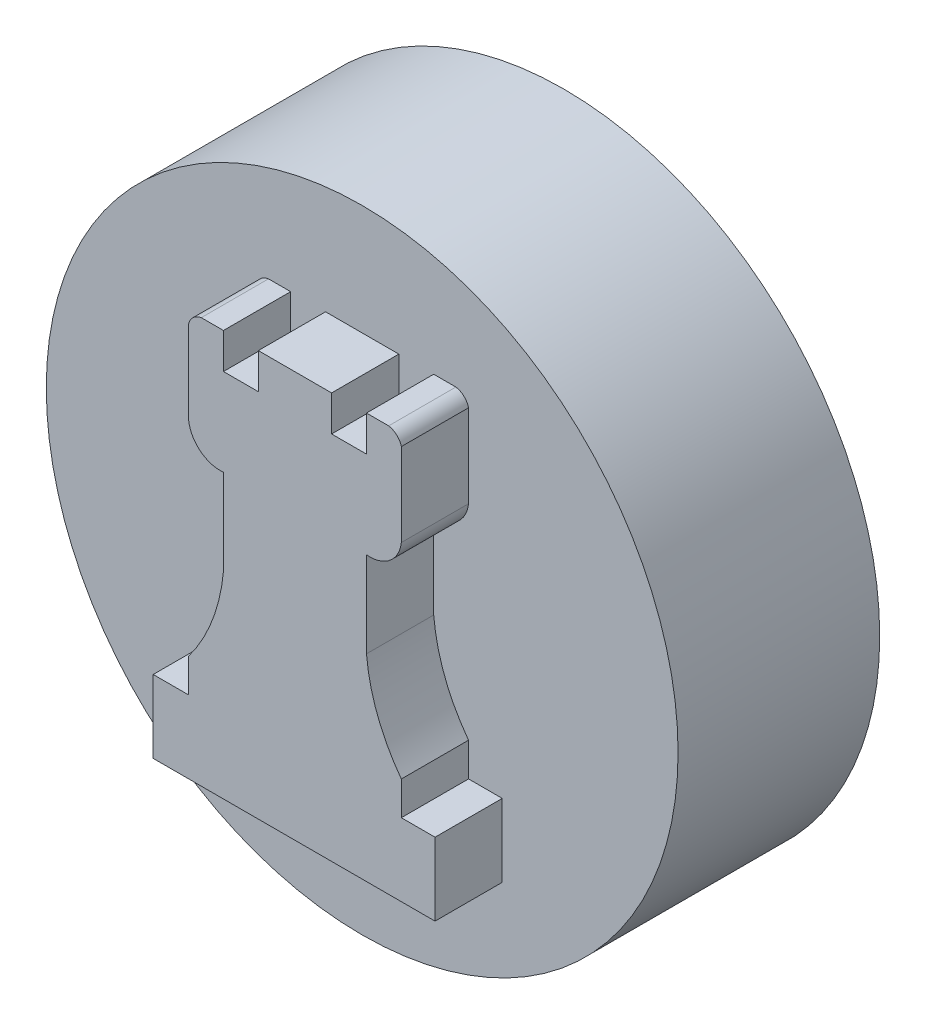
ISO-10303-21;
HEADER;
FILE_DESCRIPTION(('STEP AP214'),'2;1');
FILE_NAME('part.step','',(''),(''),'','','');
FILE_SCHEMA(('AUTOMOTIVE_DESIGN { 1 0 10303 214 1 1 1 1 }'));
ENDSEC;
DATA;
#1=APPLICATION_CONTEXT('core data for automotive mechanical design processes');
#2=APPLICATION_PROTOCOL_DEFINITION('international standard','automotive_design',2000,#1);
#3=PRODUCT_CONTEXT('',#1,'mechanical');
#4=PRODUCT('Part','Part','',(#3));
#5=PRODUCT_RELATED_PRODUCT_CATEGORY('part','',(#4));
#6=PRODUCT_DEFINITION_FORMATION('','',#4);
#7=PRODUCT_DEFINITION_CONTEXT('part definition',#1,'design');
#8=PRODUCT_DEFINITION('design','',#6,#7);
#9=PRODUCT_DEFINITION_SHAPE('','',#8);
#10=(LENGTH_UNIT() NAMED_UNIT(*) SI_UNIT(.MILLI.,.METRE.));
#11=(NAMED_UNIT(*) PLANE_ANGLE_UNIT() SI_UNIT($,.RADIAN.));
#12=(NAMED_UNIT(*) SI_UNIT($,.STERADIAN.) SOLID_ANGLE_UNIT());
#13=UNCERTAINTY_MEASURE_WITH_UNIT(LENGTH_MEASURE(1.E-05),#10,'distance_accuracy_value','');
#14=(GEOMETRIC_REPRESENTATION_CONTEXT(3) GLOBAL_UNCERTAINTY_ASSIGNED_CONTEXT((#13)) GLOBAL_UNIT_ASSIGNED_CONTEXT((#10,
#11,#12)) REPRESENTATION_CONTEXT('',''));
#15=CARTESIAN_POINT('',(0.,0.,0.));
#16=DIRECTION('',(0.,0.,1.));
#17=DIRECTION('',(1.,0.,0.));
#18=AXIS2_PLACEMENT_3D('',#15,#16,#17);
#19=CARTESIAN_POINT('',(0.,0.,7.62));
#20=DIRECTION('',(0.,0.,1.));
#21=DIRECTION('',(1.,0.,0.));
#22=AXIS2_PLACEMENT_3D('',#19,#20,#21);
#23=PLANE('',#22);
#24=CARTESIAN_POINT('',(0.,0.,7.62));
#25=DIRECTION('',(0.,0.,1.));
#26=DIRECTION('',(1.,0.,0.));
#27=AXIS2_PLACEMENT_3D('',#24,#25,#26);
#28=CIRCLE('',#27,11.938);
#29=CARTESIAN_POINT('',(11.938,0.,7.62));
#30=VERTEX_POINT('',#29);
#31=EDGE_CURVE('E346',#30,#30,#28,.T.);
#32=ORIENTED_EDGE('',*,*,#31,.T.);
#33=EDGE_LOOP('',(#32));
#34=FACE_BOUND('',#33,.T.);
#35=CARTESIAN_POINT('',(-9.40357663671607,0.480907044604512,7.62));
#36=DIRECTION('',(0.,0.,1.));
#37=DIRECTION('',(1.,0.,0.));
#38=AXIS2_PLACEMENT_3D('',#35,#36,#37);
#39=CIRCLE('',#38,6.72735140190165);
#40=CARTESIAN_POINT('',(-4.01974632510789,-3.55290356826233,7.62));
#41=VERTEX_POINT('',#40);
#42=CARTESIAN_POINT('',(-2.70272789612918,-0.115652290619804,7.62));
#43=VERTEX_POINT('',#42);
#44=EDGE_CURVE('E339',#41,#43,#39,.T.);
#45=ORIENTED_EDGE('',*,*,#44,.T.);
#46=DIRECTION('',(0.,1.,0.));
#47=VECTOR('',#46,1.);
#48=CARTESIAN_POINT('',(-2.70272789612918,-0.115652290619799,7.62));
#49=LINE('',#48,#47);
#50=CARTESIAN_POINT('',(-2.70272789612918,3.12729500495281,7.62));
#51=VERTEX_POINT('',#50);
#52=EDGE_CURVE('E55',#43,#51,#49,.T.);
#53=ORIENTED_EDGE('',*,*,#52,.T.);
#54=CARTESIAN_POINT('',(-2.83226509502715,4.31477623503355,7.62));
#55=DIRECTION('',(0.,0.,-1.));
#56=DIRECTION('',(-1.,0.,0.));
#57=AXIS2_PLACEMENT_3D('',#54,#55,#56);
#58=CIRCLE('',#57,1.19452566221593);
#59=CARTESIAN_POINT('',(-4.01974632510789,4.18523903613558,7.62));
#60=VERTEX_POINT('',#59);
#61=EDGE_CURVE('E256',#51,#60,#58,.T.);
#62=ORIENTED_EDGE('',*,*,#61,.T.);
#63=DIRECTION('',(0.,-1.,0.));
#64=VECTOR('',#63,1.);
#65=CARTESIAN_POINT('',(-4.01974632510789,7.32580244945803,7.62));
#66=LINE('',#65,#64);
#67=CARTESIAN_POINT('',(-4.01974632510789,7.32580244945803,7.62));
#68=VERTEX_POINT('',#67);
#69=EDGE_CURVE('E260',#68,#60,#66,.T.);
#70=ORIENTED_EDGE('',*,*,#69,.F.);
#71=CARTESIAN_POINT('',(-3.44383256418187,7.17841654262181,7.62));
#72=DIRECTION('',(0.,0.,1.));
#73=DIRECTION('',(1.,0.,0.));
#74=AXIS2_PLACEMENT_3D('',#71,#72,#73);
#75=CIRCLE('',#74,0.594473940183995);
#76=CARTESIAN_POINT('',(-3.54067732985531,7.76494902843956,7.62));
#77=VERTEX_POINT('',#76);
#78=EDGE_CURVE('E264',#77,#68,#75,.T.);
#79=ORIENTED_EDGE('',*,*,#78,.F.);
#80=DIRECTION('',(-1.,0.,0.));
#81=VECTOR('',#80,1.);
#82=CARTESIAN_POINT('',(-2.70272789612918,7.76494902843956,7.62));
#83=LINE('',#82,#81);
#84=CARTESIAN_POINT('',(-2.70272789612918,7.76494902843956,7.62));
#85=VERTEX_POINT('',#84);
#86=EDGE_CURVE('E267',#85,#77,#83,.T.);
#87=ORIENTED_EDGE('',*,*,#86,.F.);
#88=DIRECTION('',(0.,1.,0.));
#89=VECTOR('',#88,1.);
#90=CARTESIAN_POINT('',(-2.70272789612918,6.42089434731427,7.62));
#91=LINE('',#90,#89);
#92=CARTESIAN_POINT('',(-2.70272789612918,6.42089434731427,7.62));
#93=VERTEX_POINT('',#92);
#94=EDGE_CURVE('E270',#93,#85,#91,.T.);
#95=ORIENTED_EDGE('',*,*,#94,.F.);
#96=DIRECTION('',(-1.,0.,0.));
#97=VECTOR('',#96,1.);
#98=CARTESIAN_POINT('',(-1.38486685121872,6.42089434731427,7.62));
#99=LINE('',#98,#97);
#100=CARTESIAN_POINT('',(-1.38486685121872,6.42089434731427,7.62));
#101=VERTEX_POINT('',#100);
#102=EDGE_CURVE('E273',#101,#93,#99,.T.);
#103=ORIENTED_EDGE('',*,*,#102,.F.);
#104=DIRECTION('',(0.,-1.,0.));
#105=VECTOR('',#104,1.);
#106=CARTESIAN_POINT('',(-1.38486685121872,7.76494902843956,7.62));
#107=LINE('',#106,#105);
#108=CARTESIAN_POINT('',(-1.38486685121872,7.76494902843956,7.62));
#109=VERTEX_POINT('',#108);
#110=EDGE_CURVE('E276',#109,#101,#107,.T.);
#111=ORIENTED_EDGE('',*,*,#110,.F.);
#112=DIRECTION('',(-1.,0.,0.));
#113=VECTOR('',#112,1.);
#114=CARTESIAN_POINT('',(1.38486685121872,7.76494902843956,7.62));
#115=LINE('',#114,#113);
#116=CARTESIAN_POINT('',(1.38486685121872,7.76494902843956,7.62));
#117=VERTEX_POINT('',#116);
#118=EDGE_CURVE('E279',#117,#109,#115,.T.);
#119=ORIENTED_EDGE('',*,*,#118,.F.);
#120=DIRECTION('',(0.,-1.,0.));
#121=VECTOR('',#120,1.);
#122=CARTESIAN_POINT('',(1.38486685121872,7.76494902843956,7.62));
#123=LINE('',#122,#121);
#124=CARTESIAN_POINT('',(1.38486685121872,6.42089434731427,7.62));
#125=VERTEX_POINT('',#124);
#126=EDGE_CURVE('E282',#117,#125,#123,.T.);
#127=ORIENTED_EDGE('',*,*,#126,.T.);
#128=DIRECTION('',(1.,0.,0.));
#129=VECTOR('',#128,1.);
#130=CARTESIAN_POINT('',(1.38486685121872,6.42089434731427,7.62));
#131=LINE('',#130,#129);
#132=CARTESIAN_POINT('',(2.70272789612918,6.42089434731427,7.62));
#133=VERTEX_POINT('',#132);
#134=EDGE_CURVE('E286',#125,#133,#131,.T.);
#135=ORIENTED_EDGE('',*,*,#134,.T.);
#136=DIRECTION('',(0.,1.,0.));
#137=VECTOR('',#136,1.);
#138=CARTESIAN_POINT('',(2.70272789612918,6.42089434731427,7.62));
#139=LINE('',#138,#137);
#140=CARTESIAN_POINT('',(2.70272789612918,7.76494902843956,7.62));
#141=VERTEX_POINT('',#140);
#142=EDGE_CURVE('E290',#133,#141,#139,.T.);
#143=ORIENTED_EDGE('',*,*,#142,.T.);
#144=DIRECTION('',(1.,0.,0.));
#145=VECTOR('',#144,1.);
#146=CARTESIAN_POINT('',(2.70272789612918,7.76494902843956,7.62));
#147=LINE('',#146,#145);
#148=CARTESIAN_POINT('',(3.54067732985531,7.76494902843956,7.62));
#149=VERTEX_POINT('',#148);
#150=EDGE_CURVE('E294',#141,#149,#147,.T.);
#151=ORIENTED_EDGE('',*,*,#150,.T.);
#152=CARTESIAN_POINT('',(3.44383256418187,7.17841654262181,7.62));
#153=DIRECTION('',(0.,0.,-1.));
#154=DIRECTION('',(-1.,0.,0.));
#155=AXIS2_PLACEMENT_3D('',#152,#153,#154);
#156=CIRCLE('',#155,0.594473940183995);
#157=CARTESIAN_POINT('',(4.01974632510789,7.32580244945803,7.62));
#158=VERTEX_POINT('',#157);
#159=EDGE_CURVE('E298',#149,#158,#156,.T.);
#160=ORIENTED_EDGE('',*,*,#159,.T.);
#161=DIRECTION('',(0.,-1.,0.));
#162=VECTOR('',#161,1.);
#163=CARTESIAN_POINT('',(4.01974632510789,7.32580244945803,7.62));
#164=LINE('',#163,#162);
#165=CARTESIAN_POINT('',(4.01974632510789,4.18523903613558,7.62));
#166=VERTEX_POINT('',#165);
#167=EDGE_CURVE('E302',#158,#166,#164,.T.);
#168=ORIENTED_EDGE('',*,*,#167,.T.);
#169=CARTESIAN_POINT('',(2.83226509502715,4.31477623503355,7.62));
#170=DIRECTION('',(0.,0.,1.));
#171=DIRECTION('',(1.,0.,0.));
#172=AXIS2_PLACEMENT_3D('',#169,#170,#171);
#173=CIRCLE('',#172,1.19452566221593);
#174=CARTESIAN_POINT('',(2.70272789612918,3.12729500495281,7.62));
#175=VERTEX_POINT('',#174);
#176=EDGE_CURVE('E306',#175,#166,#173,.T.);
#177=ORIENTED_EDGE('',*,*,#176,.F.);
#178=DIRECTION('',(0.,1.,0.));
#179=VECTOR('',#178,1.);
#180=CARTESIAN_POINT('',(2.70272789612918,-0.115652290619799,7.62));
#181=LINE('',#180,#179);
#182=CARTESIAN_POINT('',(2.70272789612918,-0.115652290619799,7.62));
#183=VERTEX_POINT('',#182);
#184=EDGE_CURVE('E310',#183,#175,#181,.T.);
#185=ORIENTED_EDGE('',*,*,#184,.F.);
#186=CARTESIAN_POINT('',(9.40357663671607,0.480907044604512,7.62));
#187=DIRECTION('',(0.,0.,-1.));
#188=DIRECTION('',(-1.,0.,0.));
#189=AXIS2_PLACEMENT_3D('',#186,#187,#188);
#190=CIRCLE('',#189,6.72735140190165);
#191=CARTESIAN_POINT('',(4.01974632510789,-3.55290356826233,7.62));
#192=VERTEX_POINT('',#191);
#193=EDGE_CURVE('E313',#192,#183,#190,.T.);
#194=ORIENTED_EDGE('',*,*,#193,.F.);
#195=DIRECTION('',(0.,1.,0.));
#196=VECTOR('',#195,1.);
#197=CARTESIAN_POINT('',(4.01974632510789,-4.82074775204408,7.62));
#198=LINE('',#197,#196);
#199=CARTESIAN_POINT('',(4.01974632510789,-4.82074775204408,7.62));
#200=VERTEX_POINT('',#199);
#201=EDGE_CURVE('E316',#200,#192,#198,.T.);
#202=ORIENTED_EDGE('',*,*,#201,.F.);
#203=DIRECTION('',(1.,0.,0.));
#204=VECTOR('',#203,1.);
#205=CARTESIAN_POINT('',(4.01974632510789,-4.82074775204408,7.62));
#206=LINE('',#205,#204);
#207=CARTESIAN_POINT('',(5.29315698281423,-4.82074775204408,7.62));
#208=VERTEX_POINT('',#207);
#209=EDGE_CURVE('E319',#200,#208,#206,.T.);
#210=ORIENTED_EDGE('',*,*,#209,.T.);
#211=DIRECTION('',(0.,1.,0.));
#212=VECTOR('',#211,1.);
#213=CARTESIAN_POINT('',(5.29315698281423,-7.56802031100885,7.62));
#214=LINE('',#213,#212);
#215=CARTESIAN_POINT('',(5.29315698281423,-7.56802031100885,7.62));
#216=VERTEX_POINT('',#215);
#217=EDGE_CURVE('E323',#216,#208,#214,.T.);
#218=ORIENTED_EDGE('',*,*,#217,.F.);
#219=DIRECTION('',(1.,0.,0.));
#220=VECTOR('',#219,1.);
#221=CARTESIAN_POINT('',(-5.35723194653269,-7.56802031100885,7.62));
#222=LINE('',#221,#220);
#223=CARTESIAN_POINT('',(-5.35723194653269,-7.56802031100885,7.62));
#224=VERTEX_POINT('',#223);
#225=EDGE_CURVE('E327',#224,#216,#222,.T.);
#226=ORIENTED_EDGE('',*,*,#225,.F.);
#227=DIRECTION('',(0.,1.,0.));
#228=VECTOR('',#227,1.);
#229=CARTESIAN_POINT('',(-5.35723194653269,-7.56802031100885,7.62));
#230=LINE('',#229,#228);
#231=CARTESIAN_POINT('',(-5.35723194653269,-4.82074775204408,7.62));
#232=VERTEX_POINT('',#231);
#233=EDGE_CURVE('E330',#224,#232,#230,.T.);
#234=ORIENTED_EDGE('',*,*,#233,.T.);
#235=DIRECTION('',(1.,0.,0.));
#236=VECTOR('',#235,1.);
#237=CARTESIAN_POINT('',(-5.35723194653269,-4.82074775204408,7.62));
#238=LINE('',#237,#236);
#239=CARTESIAN_POINT('',(-4.01974632510789,-4.82074775204408,7.62));
#240=VERTEX_POINT('',#239);
#241=EDGE_CURVE('E334',#232,#240,#238,.T.);
#242=ORIENTED_EDGE('',*,*,#241,.T.);
#243=DIRECTION('',(0.,1.,0.));
#244=VECTOR('',#243,1.);
#245=CARTESIAN_POINT('',(-4.01974632510789,-4.82074775204408,7.62));
#246=LINE('',#245,#244);
#247=EDGE_CURVE('E225',#240,#41,#246,.T.);
#248=ORIENTED_EDGE('',*,*,#247,.T.);
#249=EDGE_LOOP('',(#45,#53,#62,#70,#79,#87,#95,#103,#111,#119,#127,#135,#143,#151,#160,#168,
#177,#185,#194,#202,#210,#218,#226,#234,#242,#248));
#250=FACE_BOUND('',#249,.T.);
#251=ADVANCED_FACE('F39',(#34,#250),#23,.T.);
#252=CARTESIAN_POINT('',(0.,0.,0.));
#253=DIRECTION('',(0.,0.,1.));
#254=DIRECTION('',(1.,0.,0.));
#255=AXIS2_PLACEMENT_3D('',#252,#253,#254);
#256=PLANE('',#255);
#257=CARTESIAN_POINT('',(0.,0.,0.));
#258=DIRECTION('',(0.,0.,1.));
#259=DIRECTION('',(1.,0.,0.));
#260=AXIS2_PLACEMENT_3D('',#257,#258,#259);
#261=CIRCLE('',#260,11.938);
#262=CARTESIAN_POINT('',(11.938,0.,0.));
#263=VERTEX_POINT('',#262);
#264=EDGE_CURVE('E11',#263,#263,#261,.T.);
#265=ORIENTED_EDGE('',*,*,#264,.F.);
#266=EDGE_LOOP('',(#265));
#267=FACE_BOUND('',#266,.T.);
#268=CARTESIAN_POINT('',(0.,0.,0.));
#269=DIRECTION('',(0.,0.,1.));
#270=DIRECTION('',(1.,0.,0.));
#271=AXIS2_PLACEMENT_3D('',#268,#269,#270);
#272=CIRCLE('',#271,8.763);
#273=CARTESIAN_POINT('',(8.763,0.,0.));
#274=VERTEX_POINT('',#273);
#275=EDGE_CURVE('E48',#274,#274,#272,.T.);
#276=ORIENTED_EDGE('',*,*,#275,.T.);
#277=EDGE_LOOP('',(#276));
#278=FACE_BOUND('',#277,.T.);
#279=ADVANCED_FACE('F436',(#267,#278),#256,.F.);
#280=CARTESIAN_POINT('',(0.,0.,5.08));
#281=DIRECTION('',(0.,0.,-1.));
#282=DIRECTION('',(-1.,0.,0.));
#283=AXIS2_PLACEMENT_3D('',#280,#281,#282);
#284=CYLINDRICAL_SURFACE('',#283,11.938);
#285=ORIENTED_EDGE('',*,*,#264,.T.);
#286=EDGE_LOOP('',(#285));
#287=FACE_BOUND('',#286,.T.);
#288=ORIENTED_EDGE('',*,*,#31,.F.);
#289=EDGE_LOOP('',(#288));
#290=FACE_BOUND('',#289,.T.);
#291=ADVANCED_FACE('F41',(#287,#290),#284,.T.);
#292=CARTESIAN_POINT('',(0.,0.,5.08));
#293=DIRECTION('',(0.,0.,-1.));
#294=DIRECTION('',(-1.,0.,0.));
#295=AXIS2_PLACEMENT_3D('',#292,#293,#294);
#296=CYLINDRICAL_SURFACE('',#295,8.763);
#297=CARTESIAN_POINT('',(0.,0.,5.08));
#298=DIRECTION('',(0.,0.,1.));
#299=DIRECTION('',(1.,0.,0.));
#300=AXIS2_PLACEMENT_3D('',#297,#298,#299);
#301=CIRCLE('',#300,8.763);
#302=CARTESIAN_POINT('',(8.763,0.,5.08));
#303=VERTEX_POINT('',#302);
#304=EDGE_CURVE('E429',#303,#303,#301,.T.);
#305=ORIENTED_EDGE('',*,*,#304,.T.);
#306=EDGE_LOOP('',(#305));
#307=FACE_BOUND('',#306,.T.);
#308=ORIENTED_EDGE('',*,*,#275,.F.);
#309=EDGE_LOOP('',(#308));
#310=FACE_BOUND('',#309,.T.);
#311=ADVANCED_FACE('F438',(#307,#310),#296,.F.);
#312=CARTESIAN_POINT('',(0.,0.,5.08));
#313=DIRECTION('',(0.,0.,1.));
#314=DIRECTION('',(1.,0.,0.));
#315=AXIS2_PLACEMENT_3D('',#312,#313,#314);
#316=PLANE('',#315);
#317=ORIENTED_EDGE('',*,*,#304,.F.);
#318=EDGE_LOOP('',(#317));
#319=FACE_BOUND('',#318,.T.);
#320=ADVANCED_FACE('F440',(#319),#316,.F.);
#321=CARTESIAN_POINT('',(-2.70272789612918,-0.115652290619799,10.16));
#322=DIRECTION('',(-1.,0.,0.));
#323=DIRECTION('',(0.,0.,1.));
#324=AXIS2_PLACEMENT_3D('',#321,#322,#323);
#325=PLANE('',#324);
#326=ORIENTED_EDGE('',*,*,#52,.F.);
#327=DIRECTION('',(0.,0.,-1.));
#328=VECTOR('',#327,1.);
#329=CARTESIAN_POINT('',(-2.70272789612918,-0.115652290619804,10.16));
#330=LINE('',#329,#328);
#331=CARTESIAN_POINT('',(-2.70272789612918,-0.115652290619804,10.16));
#332=VERTEX_POINT('',#331);
#333=EDGE_CURVE('E60',#332,#43,#330,.T.);
#334=ORIENTED_EDGE('',*,*,#333,.F.);
#335=DIRECTION('',(0.,1.,0.));
#336=VECTOR('',#335,1.);
#337=CARTESIAN_POINT('',(-2.70272789612918,-0.115652290619799,10.16));
#338=LINE('',#337,#336);
#339=CARTESIAN_POINT('',(-2.70272789612918,3.12729500495281,10.16));
#340=VERTEX_POINT('',#339);
#341=EDGE_CURVE('E343',#332,#340,#338,.T.);
#342=ORIENTED_EDGE('',*,*,#341,.T.);
#343=DIRECTION('',(0.,0.,-1.));
#344=VECTOR('',#343,1.);
#345=CARTESIAN_POINT('',(-2.70272789612918,3.12729500495281,10.16));
#346=LINE('',#345,#344);
#347=EDGE_CURVE('E151',#340,#51,#346,.T.);
#348=ORIENTED_EDGE('',*,*,#347,.T.);
#349=EDGE_LOOP('',(#326,#334,#342,#348));
#350=FACE_BOUND('',#349,.T.);
#351=ADVANCED_FACE('F447',(#350),#325,.T.);
#352=CARTESIAN_POINT('',(-9.40357663671607,0.480907044604512,10.16));
#353=DIRECTION('',(0.,0.,-1.));
#354=DIRECTION('',(-1.,0.,0.));
#355=AXIS2_PLACEMENT_3D('',#352,#353,#354);
#356=CYLINDRICAL_SURFACE('',#355,6.72735140190165);
#357=ORIENTED_EDGE('',*,*,#44,.F.);
#358=DIRECTION('',(0.,0.,-1.));
#359=VECTOR('',#358,1.);
#360=CARTESIAN_POINT('',(-4.01974632510789,-3.55290356826233,10.16));
#361=LINE('',#360,#359);
#362=CARTESIAN_POINT('',(-4.01974632510789,-3.55290356826233,10.16));
#363=VERTEX_POINT('',#362);
#364=EDGE_CURVE('E143',#363,#41,#361,.T.);
#365=ORIENTED_EDGE('',*,*,#364,.F.);
#366=CARTESIAN_POINT('',(-9.40357663671607,0.480907044604512,10.16));
#367=DIRECTION('',(0.,0.,1.));
#368=DIRECTION('',(1.,0.,0.));
#369=AXIS2_PLACEMENT_3D('',#366,#367,#368);
#370=CIRCLE('',#369,6.72735140190165);
#371=EDGE_CURVE('E240',#363,#332,#370,.T.);
#372=ORIENTED_EDGE('',*,*,#371,.T.);
#373=ORIENTED_EDGE('',*,*,#333,.T.);
#374=EDGE_LOOP('',(#357,#365,#372,#373));
#375=FACE_BOUND('',#374,.T.);
#376=ADVANCED_FACE('F462',(#375),#356,.F.);
#377=CARTESIAN_POINT('',(-4.01974632510789,-4.82074775204408,10.16));
#378=DIRECTION('',(-1.,0.,0.));
#379=DIRECTION('',(0.,0.,1.));
#380=AXIS2_PLACEMENT_3D('',#377,#378,#379);
#381=PLANE('',#380);
#382=ORIENTED_EDGE('',*,*,#247,.F.);
#383=DIRECTION('',(0.,0.,-1.));
#384=VECTOR('',#383,1.);
#385=CARTESIAN_POINT('',(-4.01974632510789,-4.82074775204408,10.16));
#386=LINE('',#385,#384);
#387=CARTESIAN_POINT('',(-4.01974632510789,-4.82074775204408,10.16));
#388=VERTEX_POINT('',#387);
#389=EDGE_CURVE('E219',#388,#240,#386,.T.);
#390=ORIENTED_EDGE('',*,*,#389,.F.);
#391=DIRECTION('',(0.,1.,0.));
#392=VECTOR('',#391,1.);
#393=CARTESIAN_POINT('',(-4.01974632510789,-4.82074775204408,10.16));
#394=LINE('',#393,#392);
#395=EDGE_CURVE('E222',#388,#363,#394,.T.);
#396=ORIENTED_EDGE('',*,*,#395,.T.);
#397=ORIENTED_EDGE('',*,*,#364,.T.);
#398=EDGE_LOOP('',(#382,#390,#396,#397));
#399=FACE_BOUND('',#398,.T.);
#400=ADVANCED_FACE('F221',(#399),#381,.T.);
#401=CARTESIAN_POINT('',(-5.35723194653269,-4.82074775204408,10.16));
#402=DIRECTION('',(0.,1.,0.));
#403=DIRECTION('',(0.,0.,1.));
#404=AXIS2_PLACEMENT_3D('',#401,#402,#403);
#405=PLANE('',#404);
#406=ORIENTED_EDGE('',*,*,#241,.F.);
#407=DIRECTION('',(0.,0.,-1.));
#408=VECTOR('',#407,1.);
#409=CARTESIAN_POINT('',(-5.35723194653269,-4.82074775204408,10.16));
#410=LINE('',#409,#408);
#411=CARTESIAN_POINT('',(-5.35723194653269,-4.82074775204408,10.16));
#412=VERTEX_POINT('',#411);
#413=EDGE_CURVE('E231',#412,#232,#410,.T.);
#414=ORIENTED_EDGE('',*,*,#413,.F.);
#415=DIRECTION('',(1.,0.,0.));
#416=VECTOR('',#415,1.);
#417=CARTESIAN_POINT('',(-5.35723194653269,-4.82074775204408,10.16));
#418=LINE('',#417,#416);
#419=EDGE_CURVE('E237',#412,#388,#418,.T.);
#420=ORIENTED_EDGE('',*,*,#419,.T.);
#421=ORIENTED_EDGE('',*,*,#389,.T.);
#422=EDGE_LOOP('',(#406,#414,#420,#421));
#423=FACE_BOUND('',#422,.T.);
#424=ADVANCED_FACE('F243',(#423),#405,.T.);
#425=CARTESIAN_POINT('',(-5.35723194653269,-7.56802031100885,10.16));
#426=DIRECTION('',(-1.,0.,0.));
#427=DIRECTION('',(0.,0.,1.));
#428=AXIS2_PLACEMENT_3D('',#425,#426,#427);
#429=PLANE('',#428);
#430=ORIENTED_EDGE('',*,*,#233,.F.);
#431=DIRECTION('',(0.,0.,-1.));
#432=VECTOR('',#431,1.);
#433=CARTESIAN_POINT('',(-5.35723194653269,-7.56802031100885,10.16));
#434=LINE('',#433,#432);
#435=CARTESIAN_POINT('',(-5.35723194653269,-7.56802031100885,10.16));
#436=VERTEX_POINT('',#435);
#437=EDGE_CURVE('E351',#436,#224,#434,.T.);
#438=ORIENTED_EDGE('',*,*,#437,.F.);
#439=DIRECTION('',(0.,1.,0.));
#440=VECTOR('',#439,1.);
#441=CARTESIAN_POINT('',(-5.35723194653269,-7.56802031100885,10.16));
#442=LINE('',#441,#440);
#443=EDGE_CURVE('E245',#436,#412,#442,.T.);
#444=ORIENTED_EDGE('',*,*,#443,.T.);
#445=ORIENTED_EDGE('',*,*,#413,.T.);
#446=EDGE_LOOP('',(#430,#438,#444,#445));
#447=FACE_BOUND('',#446,.T.);
#448=ADVANCED_FACE('F545',(#447),#429,.T.);
#449=CARTESIAN_POINT('',(-5.35723194653269,-7.56802031100885,10.16));
#450=DIRECTION('',(0.,1.,0.));
#451=DIRECTION('',(0.,0.,1.));
#452=AXIS2_PLACEMENT_3D('',#449,#450,#451);
#453=PLANE('',#452);
#454=ORIENTED_EDGE('',*,*,#225,.T.);
#455=DIRECTION('',(0.,0.,-1.));
#456=VECTOR('',#455,1.);
#457=CARTESIAN_POINT('',(5.29315698281423,-7.56802031100885,10.16));
#458=LINE('',#457,#456);
#459=CARTESIAN_POINT('',(5.29315698281423,-7.56802031100885,10.16));
#460=VERTEX_POINT('',#459);
#461=EDGE_CURVE('E354',#460,#216,#458,.T.);
#462=ORIENTED_EDGE('',*,*,#461,.F.);
#463=DIRECTION('',(1.,0.,0.));
#464=VECTOR('',#463,1.);
#465=CARTESIAN_POINT('',(-5.35723194653269,-7.56802031100885,10.16));
#466=LINE('',#465,#464);
#467=EDGE_CURVE('E248',#436,#460,#466,.T.);
#468=ORIENTED_EDGE('',*,*,#467,.F.);
#469=ORIENTED_EDGE('',*,*,#437,.T.);
#470=EDGE_LOOP('',(#454,#462,#468,#469));
#471=FACE_BOUND('',#470,.T.);
#472=ADVANCED_FACE('F541',(#471),#453,.F.);
#473=CARTESIAN_POINT('',(5.29315698281423,-7.56802031100885,10.16));
#474=DIRECTION('',(-1.,0.,0.));
#475=DIRECTION('',(0.,0.,1.));
#476=AXIS2_PLACEMENT_3D('',#473,#474,#475);
#477=PLANE('',#476);
#478=ORIENTED_EDGE('',*,*,#217,.T.);
#479=DIRECTION('',(0.,0.,-1.));
#480=VECTOR('',#479,1.);
#481=CARTESIAN_POINT('',(5.29315698281423,-4.82074775204408,10.16));
#482=LINE('',#481,#480);
#483=CARTESIAN_POINT('',(5.29315698281423,-4.82074775204408,10.16));
#484=VERTEX_POINT('',#483);
#485=EDGE_CURVE('E358',#484,#208,#482,.T.);
#486=ORIENTED_EDGE('',*,*,#485,.F.);
#487=DIRECTION('',(0.,1.,0.));
#488=VECTOR('',#487,1.);
#489=CARTESIAN_POINT('',(5.29315698281423,-7.56802031100885,10.16));
#490=LINE('',#489,#488);
#491=EDGE_CURVE('E756',#460,#484,#490,.T.);
#492=ORIENTED_EDGE('',*,*,#491,.F.);
#493=ORIENTED_EDGE('',*,*,#461,.T.);
#494=EDGE_LOOP('',(#478,#486,#492,#493));
#495=FACE_BOUND('',#494,.T.);
#496=ADVANCED_FACE('F537',(#495),#477,.F.);
#497=CARTESIAN_POINT('',(4.01974632510789,-4.82074775204408,10.16));
#498=DIRECTION('',(0.,1.,0.));
#499=DIRECTION('',(0.,0.,1.));
#500=AXIS2_PLACEMENT_3D('',#497,#498,#499);
#501=PLANE('',#500);
#502=ORIENTED_EDGE('',*,*,#209,.F.);
#503=DIRECTION('',(0.,0.,-1.));
#504=VECTOR('',#503,1.);
#505=CARTESIAN_POINT('',(4.01974632510789,-4.82074775204408,10.16));
#506=LINE('',#505,#504);
#507=CARTESIAN_POINT('',(4.01974632510789,-4.82074775204408,10.16));
#508=VERTEX_POINT('',#507);
#509=EDGE_CURVE('E361',#508,#200,#506,.T.);
#510=ORIENTED_EDGE('',*,*,#509,.F.);
#511=DIRECTION('',(1.,0.,0.));
#512=VECTOR('',#511,1.);
#513=CARTESIAN_POINT('',(4.01974632510789,-4.82074775204408,10.16));
#514=LINE('',#513,#512);
#515=EDGE_CURVE('E761',#508,#484,#514,.T.);
#516=ORIENTED_EDGE('',*,*,#515,.T.);
#517=ORIENTED_EDGE('',*,*,#485,.T.);
#518=EDGE_LOOP('',(#502,#510,#516,#517));
#519=FACE_BOUND('',#518,.T.);
#520=ADVANCED_FACE('F533',(#519),#501,.T.);
#521=CARTESIAN_POINT('',(4.01974632510789,-4.82074775204408,10.16));
#522=DIRECTION('',(-1.,0.,0.));
#523=DIRECTION('',(0.,0.,1.));
#524=AXIS2_PLACEMENT_3D('',#521,#522,#523);
#525=PLANE('',#524);
#526=ORIENTED_EDGE('',*,*,#201,.T.);
#527=DIRECTION('',(0.,0.,-1.));
#528=VECTOR('',#527,1.);
#529=CARTESIAN_POINT('',(4.01974632510789,-3.55290356826233,10.16));
#530=LINE('',#529,#528);
#531=CARTESIAN_POINT('',(4.01974632510789,-3.55290356826233,10.16));
#532=VERTEX_POINT('',#531);
#533=EDGE_CURVE('E364',#532,#192,#530,.T.);
#534=ORIENTED_EDGE('',*,*,#533,.F.);
#535=DIRECTION('',(0.,1.,0.));
#536=VECTOR('',#535,1.);
#537=CARTESIAN_POINT('',(4.01974632510789,-4.82074775204408,10.16));
#538=LINE('',#537,#536);
#539=EDGE_CURVE('E764',#508,#532,#538,.T.);
#540=ORIENTED_EDGE('',*,*,#539,.F.);
#541=ORIENTED_EDGE('',*,*,#509,.T.);
#542=EDGE_LOOP('',(#526,#534,#540,#541));
#543=FACE_BOUND('',#542,.T.);
#544=ADVANCED_FACE('F529',(#543),#525,.F.);
#545=CARTESIAN_POINT('',(9.40357663671607,0.480907044604512,10.16));
#546=DIRECTION('',(0.,0.,-1.));
#547=DIRECTION('',(-1.,0.,0.));
#548=AXIS2_PLACEMENT_3D('',#545,#546,#547);
#549=CYLINDRICAL_SURFACE('',#548,6.72735140190165);
#550=ORIENTED_EDGE('',*,*,#193,.T.);
#551=DIRECTION('',(0.,0.,-1.));
#552=VECTOR('',#551,1.);
#553=CARTESIAN_POINT('',(2.70272789612918,-0.115652290619799,10.16));
#554=LINE('',#553,#552);
#555=CARTESIAN_POINT('',(2.70272789612918,-0.115652290619799,10.16));
#556=VERTEX_POINT('',#555);
#557=EDGE_CURVE('E368',#556,#183,#554,.T.);
#558=ORIENTED_EDGE('',*,*,#557,.F.);
#559=CARTESIAN_POINT('',(9.40357663671607,0.480907044604512,10.16));
#560=DIRECTION('',(0.,0.,-1.));
#561=DIRECTION('',(-1.,0.,0.));
#562=AXIS2_PLACEMENT_3D('',#559,#560,#561);
#563=CIRCLE('',#562,6.72735140190165);
#564=EDGE_CURVE('E769',#532,#556,#563,.T.);
#565=ORIENTED_EDGE('',*,*,#564,.F.);
#566=ORIENTED_EDGE('',*,*,#533,.T.);
#567=EDGE_LOOP('',(#550,#558,#565,#566));
#568=FACE_BOUND('',#567,.T.);
#569=ADVANCED_FACE('F525',(#568),#549,.F.);
#570=CARTESIAN_POINT('',(2.70272789612918,-0.115652290619799,10.16));
#571=DIRECTION('',(-1.,0.,0.));
#572=DIRECTION('',(0.,0.,1.));
#573=AXIS2_PLACEMENT_3D('',#570,#571,#572);
#574=PLANE('',#573);
#575=ORIENTED_EDGE('',*,*,#184,.T.);
#576=DIRECTION('',(0.,0.,-1.));
#577=VECTOR('',#576,1.);
#578=CARTESIAN_POINT('',(2.70272789612918,3.12729500495281,10.16));
#579=LINE('',#578,#577);
#580=CARTESIAN_POINT('',(2.70272789612918,3.12729500495281,10.16));
#581=VERTEX_POINT('',#580);
#582=EDGE_CURVE('E372',#581,#175,#579,.T.);
#583=ORIENTED_EDGE('',*,*,#582,.F.);
#584=DIRECTION('',(0.,1.,0.));
#585=VECTOR('',#584,1.);
#586=CARTESIAN_POINT('',(2.70272789612918,-0.115652290619799,10.16));
#587=LINE('',#586,#585);
#588=EDGE_CURVE('E772',#556,#581,#587,.T.);
#589=ORIENTED_EDGE('',*,*,#588,.F.);
#590=ORIENTED_EDGE('',*,*,#557,.T.);
#591=EDGE_LOOP('',(#575,#583,#589,#590));
#592=FACE_BOUND('',#591,.T.);
#593=ADVANCED_FACE('F521',(#592),#574,.F.);
#594=CARTESIAN_POINT('',(2.83226509502715,4.31477623503355,10.16));
#595=DIRECTION('',(0.,0.,-1.));
#596=DIRECTION('',(-1.,0.,0.));
#597=AXIS2_PLACEMENT_3D('',#594,#595,#596);
#598=CYLINDRICAL_SURFACE('',#597,1.19452566221593);
#599=ORIENTED_EDGE('',*,*,#176,.T.);
#600=DIRECTION('',(0.,0.,-1.));
#601=VECTOR('',#600,1.);
#602=CARTESIAN_POINT('',(4.01974632510789,4.18523903613558,10.16));
#603=LINE('',#602,#601);
#604=CARTESIAN_POINT('',(4.01974632510789,4.18523903613558,10.16));
#605=VERTEX_POINT('',#604);
#606=EDGE_CURVE('E376',#605,#166,#603,.T.);
#607=ORIENTED_EDGE('',*,*,#606,.F.);
#608=CARTESIAN_POINT('',(2.83226509502715,4.31477623503355,10.16));
#609=DIRECTION('',(0.,0.,1.));
#610=DIRECTION('',(1.,0.,0.));
#611=AXIS2_PLACEMENT_3D('',#608,#609,#610);
#612=CIRCLE('',#611,1.19452566221593);
#613=EDGE_CURVE('E775',#581,#605,#612,.T.);
#614=ORIENTED_EDGE('',*,*,#613,.F.);
#615=ORIENTED_EDGE('',*,*,#582,.T.);
#616=EDGE_LOOP('',(#599,#607,#614,#615));
#617=FACE_BOUND('',#616,.T.);
#618=ADVANCED_FACE('F517',(#617),#598,.T.);
#619=CARTESIAN_POINT('',(4.01974632510789,7.32580244945803,10.16));
#620=DIRECTION('',(1.,0.,0.));
#621=DIRECTION('',(0.,0.,-1.));
#622=AXIS2_PLACEMENT_3D('',#619,#620,#621);
#623=PLANE('',#622);
#624=ORIENTED_EDGE('',*,*,#167,.F.);
#625=DIRECTION('',(0.,0.,-1.));
#626=VECTOR('',#625,1.);
#627=CARTESIAN_POINT('',(4.01974632510789,7.32580244945803,10.16));
#628=LINE('',#627,#626);
#629=CARTESIAN_POINT('',(4.01974632510789,7.32580244945803,10.16));
#630=VERTEX_POINT('',#629);
#631=EDGE_CURVE('E379',#630,#158,#628,.T.);
#632=ORIENTED_EDGE('',*,*,#631,.F.);
#633=DIRECTION('',(0.,-1.,0.));
#634=VECTOR('',#633,1.);
#635=CARTESIAN_POINT('',(4.01974632510789,7.32580244945803,10.16));
#636=LINE('',#635,#634);
#637=EDGE_CURVE('E778',#630,#605,#636,.T.);
#638=ORIENTED_EDGE('',*,*,#637,.T.);
#639=ORIENTED_EDGE('',*,*,#606,.T.);
#640=EDGE_LOOP('',(#624,#632,#638,#639));
#641=FACE_BOUND('',#640,.T.);
#642=ADVANCED_FACE('F513',(#641),#623,.T.);
#643=CARTESIAN_POINT('',(3.44383256418187,7.17841654262181,10.16));
#644=DIRECTION('',(0.,0.,-1.));
#645=DIRECTION('',(-1.,0.,0.));
#646=AXIS2_PLACEMENT_3D('',#643,#644,#645);
#647=CYLINDRICAL_SURFACE('',#646,0.594473940183995);
#648=ORIENTED_EDGE('',*,*,#159,.F.);
#649=DIRECTION('',(0.,0.,-1.));
#650=VECTOR('',#649,1.);
#651=CARTESIAN_POINT('',(3.54067732985531,7.76494902843956,10.16));
#652=LINE('',#651,#650);
#653=CARTESIAN_POINT('',(3.54067732985531,7.76494902843956,10.16));
#654=VERTEX_POINT('',#653);
#655=EDGE_CURVE('E382',#654,#149,#652,.T.);
#656=ORIENTED_EDGE('',*,*,#655,.F.);
#657=CARTESIAN_POINT('',(3.44383256418187,7.17841654262181,10.16));
#658=DIRECTION('',(0.,0.,-1.));
#659=DIRECTION('',(-1.,0.,0.));
#660=AXIS2_PLACEMENT_3D('',#657,#658,#659);
#661=CIRCLE('',#660,0.594473940183995);
#662=EDGE_CURVE('E782',#654,#630,#661,.T.);
#663=ORIENTED_EDGE('',*,*,#662,.T.);
#664=ORIENTED_EDGE('',*,*,#631,.T.);
#665=EDGE_LOOP('',(#648,#656,#663,#664));
#666=FACE_BOUND('',#665,.T.);
#667=ADVANCED_FACE('F509',(#666),#647,.T.);
#668=CARTESIAN_POINT('',(2.70272789612918,7.76494902843956,10.16));
#669=DIRECTION('',(0.,1.,0.));
#670=DIRECTION('',(0.,0.,1.));
#671=AXIS2_PLACEMENT_3D('',#668,#669,#670);
#672=PLANE('',#671);
#673=ORIENTED_EDGE('',*,*,#150,.F.);
#674=DIRECTION('',(0.,0.,-1.));
#675=VECTOR('',#674,1.);
#676=CARTESIAN_POINT('',(2.70272789612918,7.76494902843956,10.16));
#677=LINE('',#676,#675);
#678=CARTESIAN_POINT('',(2.70272789612918,7.76494902843956,10.16));
#679=VERTEX_POINT('',#678);
#680=EDGE_CURVE('E385',#679,#141,#677,.T.);
#681=ORIENTED_EDGE('',*,*,#680,.F.);
#682=DIRECTION('',(1.,0.,0.));
#683=VECTOR('',#682,1.);
#684=CARTESIAN_POINT('',(2.70272789612918,7.76494902843956,10.16));
#685=LINE('',#684,#683);
#686=EDGE_CURVE('E786',#679,#654,#685,.T.);
#687=ORIENTED_EDGE('',*,*,#686,.T.);
#688=ORIENTED_EDGE('',*,*,#655,.T.);
#689=EDGE_LOOP('',(#673,#681,#687,#688));
#690=FACE_BOUND('',#689,.T.);
#691=ADVANCED_FACE('F505',(#690),#672,.T.);
#692=CARTESIAN_POINT('',(2.70272789612918,6.42089434731427,10.16));
#693=DIRECTION('',(-1.,0.,0.));
#694=DIRECTION('',(0.,0.,1.));
#695=AXIS2_PLACEMENT_3D('',#692,#693,#694);
#696=PLANE('',#695);
#697=ORIENTED_EDGE('',*,*,#142,.F.);
#698=DIRECTION('',(0.,0.,-1.));
#699=VECTOR('',#698,1.);
#700=CARTESIAN_POINT('',(2.70272789612918,6.42089434731427,10.16));
#701=LINE('',#700,#699);
#702=CARTESIAN_POINT('',(2.70272789612918,6.42089434731427,10.16));
#703=VERTEX_POINT('',#702);
#704=EDGE_CURVE('E388',#703,#133,#701,.T.);
#705=ORIENTED_EDGE('',*,*,#704,.F.);
#706=DIRECTION('',(0.,1.,0.));
#707=VECTOR('',#706,1.);
#708=CARTESIAN_POINT('',(2.70272789612918,6.42089434731427,10.16));
#709=LINE('',#708,#707);
#710=EDGE_CURVE('E790',#703,#679,#709,.T.);
#711=ORIENTED_EDGE('',*,*,#710,.T.);
#712=ORIENTED_EDGE('',*,*,#680,.T.);
#713=EDGE_LOOP('',(#697,#705,#711,#712));
#714=FACE_BOUND('',#713,.T.);
#715=ADVANCED_FACE('F501',(#714),#696,.T.);
#716=CARTESIAN_POINT('',(1.38486685121872,6.42089434731427,10.16));
#717=DIRECTION('',(0.,1.,0.));
#718=DIRECTION('',(0.,0.,1.));
#719=AXIS2_PLACEMENT_3D('',#716,#717,#718);
#720=PLANE('',#719);
#721=ORIENTED_EDGE('',*,*,#134,.F.);
#722=DIRECTION('',(0.,0.,-1.));
#723=VECTOR('',#722,1.);
#724=CARTESIAN_POINT('',(1.38486685121872,6.42089434731427,10.16));
#725=LINE('',#724,#723);
#726=CARTESIAN_POINT('',(1.38486685121872,6.42089434731427,10.16));
#727=VERTEX_POINT('',#726);
#728=EDGE_CURVE('E391',#727,#125,#725,.T.);
#729=ORIENTED_EDGE('',*,*,#728,.F.);
#730=DIRECTION('',(1.,0.,0.));
#731=VECTOR('',#730,1.);
#732=CARTESIAN_POINT('',(1.38486685121872,6.42089434731427,10.16));
#733=LINE('',#732,#731);
#734=EDGE_CURVE('E794',#727,#703,#733,.T.);
#735=ORIENTED_EDGE('',*,*,#734,.T.);
#736=ORIENTED_EDGE('',*,*,#704,.T.);
#737=EDGE_LOOP('',(#721,#729,#735,#736));
#738=FACE_BOUND('',#737,.T.);
#739=ADVANCED_FACE('F497',(#738),#720,.T.);
#740=CARTESIAN_POINT('',(1.38486685121872,7.76494902843956,10.16));
#741=DIRECTION('',(1.,0.,0.));
#742=DIRECTION('',(0.,0.,-1.));
#743=AXIS2_PLACEMENT_3D('',#740,#741,#742);
#744=PLANE('',#743);
#745=ORIENTED_EDGE('',*,*,#126,.F.);
#746=DIRECTION('',(0.,0.,-1.));
#747=VECTOR('',#746,1.);
#748=CARTESIAN_POINT('',(1.38486685121872,7.76494902843956,10.16));
#749=LINE('',#748,#747);
#750=CARTESIAN_POINT('',(1.38486685121872,7.76494902843956,10.16));
#751=VERTEX_POINT('',#750);
#752=EDGE_CURVE('E394',#751,#117,#749,.T.);
#753=ORIENTED_EDGE('',*,*,#752,.F.);
#754=DIRECTION('',(0.,-1.,0.));
#755=VECTOR('',#754,1.);
#756=CARTESIAN_POINT('',(1.38486685121872,7.76494902843956,10.16));
#757=LINE('',#756,#755);
#758=EDGE_CURVE('E798',#751,#727,#757,.T.);
#759=ORIENTED_EDGE('',*,*,#758,.T.);
#760=ORIENTED_EDGE('',*,*,#728,.T.);
#761=EDGE_LOOP('',(#745,#753,#759,#760));
#762=FACE_BOUND('',#761,.T.);
#763=ADVANCED_FACE('F493',(#762),#744,.T.);
#764=CARTESIAN_POINT('',(1.38486685121872,7.76494902843956,10.16));
#765=DIRECTION('',(0.,-1.,0.));
#766=DIRECTION('',(0.,0.,-1.));
#767=AXIS2_PLACEMENT_3D('',#764,#765,#766);
#768=PLANE('',#767);
#769=ORIENTED_EDGE('',*,*,#118,.T.);
#770=DIRECTION('',(0.,0.,-1.));
#771=VECTOR('',#770,1.);
#772=CARTESIAN_POINT('',(-1.38486685121872,7.76494902843956,10.16));
#773=LINE('',#772,#771);
#774=CARTESIAN_POINT('',(-1.38486685121872,7.76494902843956,10.16));
#775=VERTEX_POINT('',#774);
#776=EDGE_CURVE('E397',#775,#109,#773,.T.);
#777=ORIENTED_EDGE('',*,*,#776,.F.);
#778=DIRECTION('',(-1.,0.,0.));
#779=VECTOR('',#778,1.);
#780=CARTESIAN_POINT('',(1.38486685121872,7.76494902843956,10.16));
#781=LINE('',#780,#779);
#782=EDGE_CURVE('E802',#751,#775,#781,.T.);
#783=ORIENTED_EDGE('',*,*,#782,.F.);
#784=ORIENTED_EDGE('',*,*,#752,.T.);
#785=EDGE_LOOP('',(#769,#777,#783,#784));
#786=FACE_BOUND('',#785,.T.);
#787=ADVANCED_FACE('F489',(#786),#768,.F.);
#788=CARTESIAN_POINT('',(-1.38486685121872,7.76494902843956,10.16));
#789=DIRECTION('',(1.,0.,0.));
#790=DIRECTION('',(0.,0.,-1.));
#791=AXIS2_PLACEMENT_3D('',#788,#789,#790);
#792=PLANE('',#791);
#793=ORIENTED_EDGE('',*,*,#110,.T.);
#794=DIRECTION('',(0.,0.,-1.));
#795=VECTOR('',#794,1.);
#796=CARTESIAN_POINT('',(-1.38486685121872,6.42089434731427,10.16));
#797=LINE('',#796,#795);
#798=CARTESIAN_POINT('',(-1.38486685121872,6.42089434731427,10.16));
#799=VERTEX_POINT('',#798);
#800=EDGE_CURVE('E401',#799,#101,#797,.T.);
#801=ORIENTED_EDGE('',*,*,#800,.F.);
#802=DIRECTION('',(0.,-1.,0.));
#803=VECTOR('',#802,1.);
#804=CARTESIAN_POINT('',(-1.38486685121872,7.76494902843956,10.16));
#805=LINE('',#804,#803);
#806=EDGE_CURVE('E805',#775,#799,#805,.T.);
#807=ORIENTED_EDGE('',*,*,#806,.F.);
#808=ORIENTED_EDGE('',*,*,#776,.T.);
#809=EDGE_LOOP('',(#793,#801,#807,#808));
#810=FACE_BOUND('',#809,.T.);
#811=ADVANCED_FACE('F485',(#810),#792,.F.);
#812=CARTESIAN_POINT('',(-1.38486685121872,6.42089434731427,10.16));
#813=DIRECTION('',(0.,-1.,0.));
#814=DIRECTION('',(0.,0.,-1.));
#815=AXIS2_PLACEMENT_3D('',#812,#813,#814);
#816=PLANE('',#815);
#817=ORIENTED_EDGE('',*,*,#102,.T.);
#818=DIRECTION('',(0.,0.,-1.));
#819=VECTOR('',#818,1.);
#820=CARTESIAN_POINT('',(-2.70272789612918,6.42089434731427,10.16));
#821=LINE('',#820,#819);
#822=CARTESIAN_POINT('',(-2.70272789612918,6.42089434731427,10.16));
#823=VERTEX_POINT('',#822);
#824=EDGE_CURVE('E405',#823,#93,#821,.T.);
#825=ORIENTED_EDGE('',*,*,#824,.F.);
#826=DIRECTION('',(-1.,0.,0.));
#827=VECTOR('',#826,1.);
#828=CARTESIAN_POINT('',(-1.38486685121872,6.42089434731427,10.16));
#829=LINE('',#828,#827);
#830=EDGE_CURVE('E808',#799,#823,#829,.T.);
#831=ORIENTED_EDGE('',*,*,#830,.F.);
#832=ORIENTED_EDGE('',*,*,#800,.T.);
#833=EDGE_LOOP('',(#817,#825,#831,#832));
#834=FACE_BOUND('',#833,.T.);
#835=ADVANCED_FACE('F481',(#834),#816,.F.);
#836=CARTESIAN_POINT('',(-2.70272789612918,6.42089434731427,10.16));
#837=DIRECTION('',(-1.,0.,0.));
#838=DIRECTION('',(0.,0.,1.));
#839=AXIS2_PLACEMENT_3D('',#836,#837,#838);
#840=PLANE('',#839);
#841=ORIENTED_EDGE('',*,*,#94,.T.);
#842=DIRECTION('',(0.,0.,-1.));
#843=VECTOR('',#842,1.);
#844=CARTESIAN_POINT('',(-2.70272789612918,7.76494902843956,10.16));
#845=LINE('',#844,#843);
#846=CARTESIAN_POINT('',(-2.70272789612918,7.76494902843956,10.16));
#847=VERTEX_POINT('',#846);
#848=EDGE_CURVE('E409',#847,#85,#845,.T.);
#849=ORIENTED_EDGE('',*,*,#848,.F.);
#850=DIRECTION('',(0.,1.,0.));
#851=VECTOR('',#850,1.);
#852=CARTESIAN_POINT('',(-2.70272789612918,6.42089434731427,10.16));
#853=LINE('',#852,#851);
#854=EDGE_CURVE('E811',#823,#847,#853,.T.);
#855=ORIENTED_EDGE('',*,*,#854,.F.);
#856=ORIENTED_EDGE('',*,*,#824,.T.);
#857=EDGE_LOOP('',(#841,#849,#855,#856));
#858=FACE_BOUND('',#857,.T.);
#859=ADVANCED_FACE('F477',(#858),#840,.F.);
#860=CARTESIAN_POINT('',(-2.70272789612918,7.76494902843956,10.16));
#861=DIRECTION('',(0.,-1.,0.));
#862=DIRECTION('',(0.,0.,-1.));
#863=AXIS2_PLACEMENT_3D('',#860,#861,#862);
#864=PLANE('',#863);
#865=ORIENTED_EDGE('',*,*,#86,.T.);
#866=DIRECTION('',(0.,0.,-1.));
#867=VECTOR('',#866,1.);
#868=CARTESIAN_POINT('',(-3.54067732985531,7.76494902843956,10.16));
#869=LINE('',#868,#867);
#870=CARTESIAN_POINT('',(-3.54067732985531,7.76494902843956,10.16));
#871=VERTEX_POINT('',#870);
#872=EDGE_CURVE('E413',#871,#77,#869,.T.);
#873=ORIENTED_EDGE('',*,*,#872,.F.);
#874=DIRECTION('',(-1.,0.,0.));
#875=VECTOR('',#874,1.);
#876=CARTESIAN_POINT('',(-2.70272789612918,7.76494902843956,10.16));
#877=LINE('',#876,#875);
#878=EDGE_CURVE('E814',#847,#871,#877,.T.);
#879=ORIENTED_EDGE('',*,*,#878,.F.);
#880=ORIENTED_EDGE('',*,*,#848,.T.);
#881=EDGE_LOOP('',(#865,#873,#879,#880));
#882=FACE_BOUND('',#881,.T.);
#883=ADVANCED_FACE('F473',(#882),#864,.F.);
#884=CARTESIAN_POINT('',(-3.44383256418187,7.17841654262181,10.16));
#885=DIRECTION('',(0.,0.,-1.));
#886=DIRECTION('',(-1.,0.,0.));
#887=AXIS2_PLACEMENT_3D('',#884,#885,#886);
#888=CYLINDRICAL_SURFACE('',#887,0.594473940183995);
#889=ORIENTED_EDGE('',*,*,#78,.T.);
#890=DIRECTION('',(0.,0.,-1.));
#891=VECTOR('',#890,1.);
#892=CARTESIAN_POINT('',(-4.01974632510789,7.32580244945803,10.16));
#893=LINE('',#892,#891);
#894=CARTESIAN_POINT('',(-4.01974632510789,7.32580244945803,10.16));
#895=VERTEX_POINT('',#894);
#896=EDGE_CURVE('E417',#895,#68,#893,.T.);
#897=ORIENTED_EDGE('',*,*,#896,.F.);
#898=CARTESIAN_POINT('',(-3.44383256418187,7.17841654262181,10.16));
#899=DIRECTION('',(0.,0.,1.));
#900=DIRECTION('',(1.,0.,0.));
#901=AXIS2_PLACEMENT_3D('',#898,#899,#900);
#902=CIRCLE('',#901,0.594473940183995);
#903=EDGE_CURVE('E817',#871,#895,#902,.T.);
#904=ORIENTED_EDGE('',*,*,#903,.F.);
#905=ORIENTED_EDGE('',*,*,#872,.T.);
#906=EDGE_LOOP('',(#889,#897,#904,#905));
#907=FACE_BOUND('',#906,.T.);
#908=ADVANCED_FACE('F469',(#907),#888,.T.);
#909=CARTESIAN_POINT('',(-4.01974632510789,7.32580244945803,10.16));
#910=DIRECTION('',(1.,0.,0.));
#911=DIRECTION('',(0.,0.,-1.));
#912=AXIS2_PLACEMENT_3D('',#909,#910,#911);
#913=PLANE('',#912);
#914=ORIENTED_EDGE('',*,*,#69,.T.);
#915=DIRECTION('',(0.,0.,-1.));
#916=VECTOR('',#915,1.);
#917=CARTESIAN_POINT('',(-4.01974632510789,4.18523903613558,10.16));
#918=LINE('',#917,#916);
#919=CARTESIAN_POINT('',(-4.01974632510789,4.18523903613558,10.16));
#920=VERTEX_POINT('',#919);
#921=EDGE_CURVE('E421',#920,#60,#918,.T.);
#922=ORIENTED_EDGE('',*,*,#921,.F.);
#923=DIRECTION('',(0.,-1.,0.));
#924=VECTOR('',#923,1.);
#925=CARTESIAN_POINT('',(-4.01974632510789,7.32580244945803,10.16));
#926=LINE('',#925,#924);
#927=EDGE_CURVE('E820',#895,#920,#926,.T.);
#928=ORIENTED_EDGE('',*,*,#927,.F.);
#929=ORIENTED_EDGE('',*,*,#896,.T.);
#930=EDGE_LOOP('',(#914,#922,#928,#929));
#931=FACE_BOUND('',#930,.T.);
#932=ADVANCED_FACE('F466',(#931),#913,.F.);
#933=CARTESIAN_POINT('',(-2.83226509502715,4.31477623503355,10.16));
#934=DIRECTION('',(0.,0.,-1.));
#935=DIRECTION('',(-1.,0.,0.));
#936=AXIS2_PLACEMENT_3D('',#933,#934,#935);
#937=CYLINDRICAL_SURFACE('',#936,1.19452566221593);
#938=ORIENTED_EDGE('',*,*,#61,.F.);
#939=ORIENTED_EDGE('',*,*,#347,.F.);
#940=CARTESIAN_POINT('',(-2.83226509502715,4.31477623503355,10.16));
#941=DIRECTION('',(0.,0.,-1.));
#942=DIRECTION('',(-1.,0.,0.));
#943=AXIS2_PLACEMENT_3D('',#940,#941,#942);
#944=CIRCLE('',#943,1.19452566221593);
#945=EDGE_CURVE('E823',#340,#920,#944,.T.);
#946=ORIENTED_EDGE('',*,*,#945,.T.);
#947=ORIENTED_EDGE('',*,*,#921,.T.);
#948=EDGE_LOOP('',(#938,#939,#946,#947));
#949=FACE_BOUND('',#948,.T.);
#950=ADVANCED_FACE('F463',(#949),#937,.T.);
#951=CARTESIAN_POINT('',(-2.83226509502715,4.31477623503355,10.16));
#952=DIRECTION('',(0.,0.,-1.));
#953=DIRECTION('',(-1.,0.,0.));
#954=AXIS2_PLACEMENT_3D('',#951,#952,#953);
#955=PLANE('',#954);
#956=ORIENTED_EDGE('',*,*,#341,.F.);
#957=ORIENTED_EDGE('',*,*,#371,.F.);
#958=ORIENTED_EDGE('',*,*,#395,.F.);
#959=ORIENTED_EDGE('',*,*,#419,.F.);
#960=ORIENTED_EDGE('',*,*,#443,.F.);
#961=ORIENTED_EDGE('',*,*,#467,.T.);
#962=ORIENTED_EDGE('',*,*,#491,.T.);
#963=ORIENTED_EDGE('',*,*,#515,.F.);
#964=ORIENTED_EDGE('',*,*,#539,.T.);
#965=ORIENTED_EDGE('',*,*,#564,.T.);
#966=ORIENTED_EDGE('',*,*,#588,.T.);
#967=ORIENTED_EDGE('',*,*,#613,.T.);
#968=ORIENTED_EDGE('',*,*,#637,.F.);
#969=ORIENTED_EDGE('',*,*,#662,.F.);
#970=ORIENTED_EDGE('',*,*,#686,.F.);
#971=ORIENTED_EDGE('',*,*,#710,.F.);
#972=ORIENTED_EDGE('',*,*,#734,.F.);
#973=ORIENTED_EDGE('',*,*,#758,.F.);
#974=ORIENTED_EDGE('',*,*,#782,.T.);
#975=ORIENTED_EDGE('',*,*,#806,.T.);
#976=ORIENTED_EDGE('',*,*,#830,.T.);
#977=ORIENTED_EDGE('',*,*,#854,.T.);
#978=ORIENTED_EDGE('',*,*,#878,.T.);
#979=ORIENTED_EDGE('',*,*,#903,.T.);
#980=ORIENTED_EDGE('',*,*,#927,.T.);
#981=ORIENTED_EDGE('',*,*,#945,.F.);
#982=EDGE_LOOP('',(#956,#957,#958,#959,#960,#961,#962,#963,#964,#965,#966,#967,#968,#969,#970,
#971,#972,#973,#974,#975,#976,#977,#978,#979,#980,#981));
#983=FACE_BOUND('',#982,.T.);
#984=ADVANCED_FACE('F235',(#983),#955,.F.);
#985=CLOSED_SHELL('',(#251,#279,#291,#311,#320,#351,#376,#400,#424,#448,#472,#496,#520,#544,
#569,#593,#618,#642,#667,#691,#715,#739,#763,#787,#811,#835,#859,#883,#908,#932,#950,#984));
#986=MANIFOLD_SOLID_BREP('B2',#985);
#987=ADVANCED_BREP_SHAPE_REPRESENTATION('',(#18,#986),#14);
#988=SHAPE_DEFINITION_REPRESENTATION(#9,#987);
ENDSEC;
END-ISO-10303-21;
